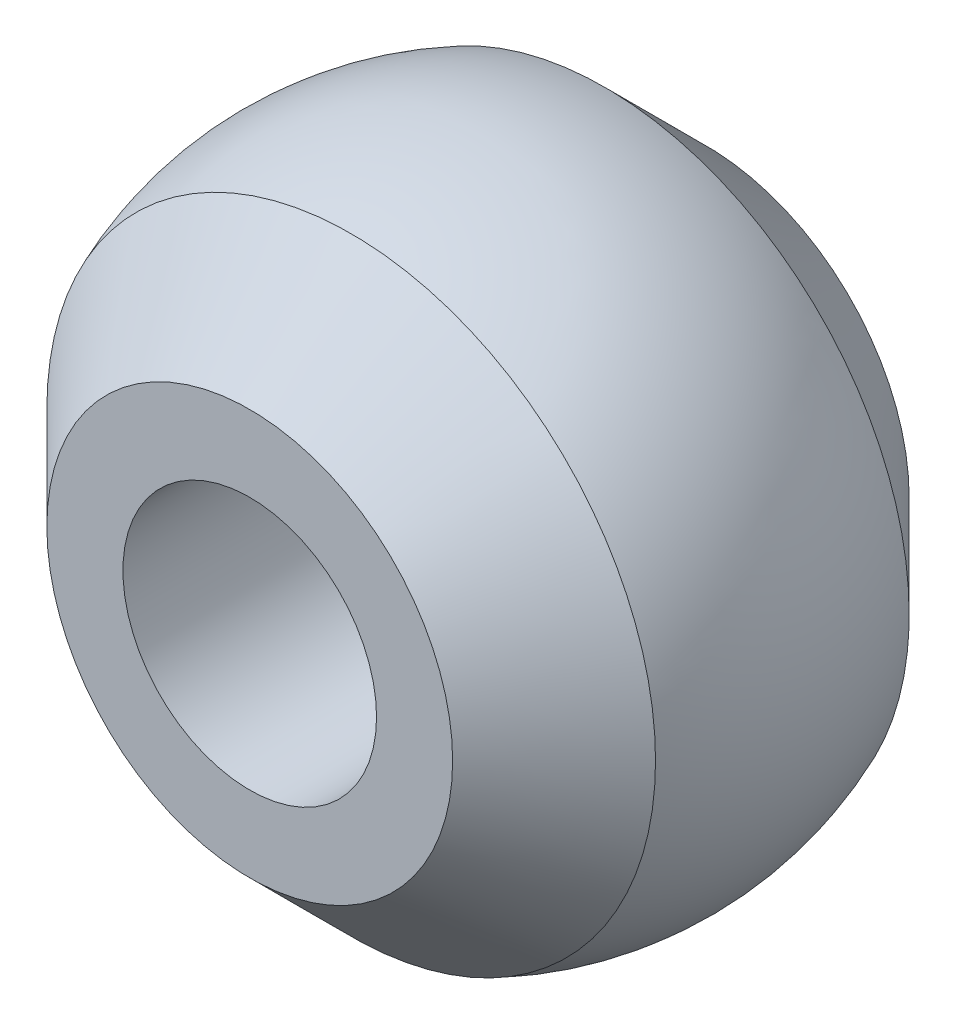
ISO-10303-21;
HEADER;
FILE_DESCRIPTION(('STEP AP214'),'2;1');
FILE_NAME('part.step','',(''),(''),'','','');
FILE_SCHEMA(('AUTOMOTIVE_DESIGN { 1 0 10303 214 1 1 1 1 }'));
ENDSEC;
DATA;
#1=APPLICATION_CONTEXT('core data for automotive mechanical design processes');
#2=APPLICATION_PROTOCOL_DEFINITION('international standard','automotive_design',2000,#1);
#3=PRODUCT_CONTEXT('',#1,'mechanical');
#4=PRODUCT('Part','Part','',(#3));
#5=PRODUCT_RELATED_PRODUCT_CATEGORY('part','',(#4));
#6=PRODUCT_DEFINITION_FORMATION('','',#4);
#7=PRODUCT_DEFINITION_CONTEXT('part definition',#1,'design');
#8=PRODUCT_DEFINITION('design','',#6,#7);
#9=PRODUCT_DEFINITION_SHAPE('','',#8);
#10=(LENGTH_UNIT() NAMED_UNIT(*) SI_UNIT(.MILLI.,.METRE.));
#11=(NAMED_UNIT(*) PLANE_ANGLE_UNIT() SI_UNIT($,.RADIAN.));
#12=(NAMED_UNIT(*) SI_UNIT($,.STERADIAN.) SOLID_ANGLE_UNIT());
#13=UNCERTAINTY_MEASURE_WITH_UNIT(LENGTH_MEASURE(1.E-05),#10,'distance_accuracy_value','');
#14=(GEOMETRIC_REPRESENTATION_CONTEXT(3) GLOBAL_UNCERTAINTY_ASSIGNED_CONTEXT((#13)) GLOBAL_UNIT_ASSIGNED_CONTEXT((#10,
#11,#12)) REPRESENTATION_CONTEXT('',''));
#15=CARTESIAN_POINT('',(0.,0.,0.));
#16=DIRECTION('',(0.,0.,1.));
#17=DIRECTION('',(1.,0.,0.));
#18=AXIS2_PLACEMENT_3D('',#15,#16,#17);
#19=CARTESIAN_POINT('',(0.,14.5,4.5));
#20=DIRECTION('',(0.,0.,1.));
#21=DIRECTION('',(1.,0.,0.));
#22=AXIS2_PLACEMENT_3D('',#19,#20,#21);
#23=PLANE('',#22);
#24=CARTESIAN_POINT('',(0.,14.5,4.5));
#25=DIRECTION('',(0.,0.,1.));
#26=DIRECTION('',(1.,0.,0.));
#27=AXIS2_PLACEMENT_3D('',#24,#25,#26);
#28=CIRCLE('',#27,2.5);
#29=CARTESIAN_POINT('',(2.5,14.5,4.5));
#30=VERTEX_POINT('',#29);
#31=EDGE_CURVE('E68',#30,#30,#28,.T.);
#32=ORIENTED_EDGE('',*,*,#31,.F.);
#33=EDGE_LOOP('',(#32));
#34=FACE_BOUND('',#33,.T.);
#35=CARTESIAN_POINT('',(0.,14.5,4.5));
#36=DIRECTION('',(0.,0.,1.));
#37=DIRECTION('',(1.,0.,0.));
#38=AXIS2_PLACEMENT_3D('',#35,#36,#37);
#39=CIRCLE('',#38,4.);
#40=CARTESIAN_POINT('',(4.,14.5,4.5));
#41=VERTEX_POINT('',#40);
#42=EDGE_CURVE('E11',#41,#41,#39,.T.);
#43=ORIENTED_EDGE('',*,*,#42,.T.);
#44=EDGE_LOOP('',(#43));
#45=FACE_BOUND('',#44,.T.);
#46=ADVANCED_FACE('F43',(#34,#45),#23,.T.);
#47=CARTESIAN_POINT('',(0.,14.5,4.5));
#48=DIRECTION('',(0.,0.,-1.));
#49=DIRECTION('',(-1.,0.,0.));
#50=AXIS2_PLACEMENT_3D('',#47,#48,#49);
#51=CONICAL_SURFACE('',#50,4.,0.785398163397448);
#52=ORIENTED_EDGE('',*,*,#42,.F.);
#53=EDGE_LOOP('',(#52));
#54=FACE_BOUND('',#53,.T.);
#55=CARTESIAN_POINT('',(0.,14.5,2.5));
#56=DIRECTION('',(0.,0.,1.));
#57=DIRECTION('',(1.,0.,0.));
#58=AXIS2_PLACEMENT_3D('',#55,#56,#57);
#59=CIRCLE('',#58,6.);
#60=CARTESIAN_POINT('',(6.,14.5,2.5));
#61=VERTEX_POINT('',#60);
#62=EDGE_CURVE('E76',#61,#61,#59,.T.);
#63=ORIENTED_EDGE('',*,*,#62,.T.);
#64=EDGE_LOOP('',(#63));
#65=FACE_BOUND('',#64,.T.);
#66=ADVANCED_FACE('F45',(#54,#65),#51,.T.);
#67=CARTESIAN_POINT('',(0.,14.5,-4.5));
#68=DIRECTION('',(0.,0.,-1.));
#69=DIRECTION('',(1.,0.,0.));
#70=AXIS2_PLACEMENT_3D('',#67,#68,#69);
#71=PLANE('',#70);
#72=CARTESIAN_POINT('',(0.,14.5,-4.5));
#73=DIRECTION('',(0.,0.,-1.));
#74=DIRECTION('',(-1.,0.,0.));
#75=AXIS2_PLACEMENT_3D('',#72,#73,#74);
#76=CIRCLE('',#75,2.5);
#77=CARTESIAN_POINT('',(-2.5,14.5,-4.5));
#78=VERTEX_POINT('',#77);
#79=EDGE_CURVE('E60',#78,#78,#76,.T.);
#80=ORIENTED_EDGE('',*,*,#79,.F.);
#81=EDGE_LOOP('',(#80));
#82=FACE_BOUND('',#81,.T.);
#83=CARTESIAN_POINT('',(0.,14.5,-4.5));
#84=DIRECTION('',(0.,0.,1.));
#85=DIRECTION('',(-1.,0.,0.));
#86=AXIS2_PLACEMENT_3D('',#83,#84,#85);
#87=CIRCLE('',#86,4.);
#88=CARTESIAN_POINT('',(-4.,14.5,-4.5));
#89=VERTEX_POINT('',#88);
#90=EDGE_CURVE('E54',#89,#89,#87,.T.);
#91=ORIENTED_EDGE('',*,*,#90,.F.);
#92=EDGE_LOOP('',(#91));
#93=FACE_BOUND('',#92,.T.);
#94=ADVANCED_FACE('F101',(#82,#93),#71,.T.);
#95=CARTESIAN_POINT('',(0.,14.5,-4.5));
#96=DIRECTION('',(0.,0.,1.));
#97=DIRECTION('',(-1.,0.,0.));
#98=AXIS2_PLACEMENT_3D('',#95,#96,#97);
#99=CONICAL_SURFACE('',#98,4.,0.785398163397448);
#100=ORIENTED_EDGE('',*,*,#90,.T.);
#101=EDGE_LOOP('',(#100));
#102=FACE_BOUND('',#101,.T.);
#103=CARTESIAN_POINT('',(6.,14.5,-2.5));
#104=CARTESIAN_POINT('',(6.00000208253265,14.5981748695653,-2.5));
#105=CARTESIAN_POINT('',(5.99759050275092,14.6963495619276,-2.5));
#106=CARTESIAN_POINT('',(5.98795497171115,14.8924625300015,-2.5));
#107=CARTESIAN_POINT('',(5.98073102045312,14.9904008057131,-2.5));
#108=CARTESIAN_POINT('',(5.96148569961324,15.1858048782416,-2.5));
#109=CARTESIAN_POINT('',(5.94946433003139,15.2832706750584,-2.5));
#110=CARTESIAN_POINT('',(5.92065378954598,15.4774950184059,-2.5));
#111=CARTESIAN_POINT('',(5.90386461864243,15.5742535649366,-2.5));
#112=CARTESIAN_POINT('',(5.86555874619633,15.7668302992569,-2.5));
#113=CARTESIAN_POINT('',(5.84404204465378,15.8626484870464,-2.5));
#114=CARTESIAN_POINT('',(5.79633299368075,16.0531136717927,-2.5));
#115=CARTESIAN_POINT('',(5.77014064425027,16.1477606687495,-2.5));
#116=CARTESIAN_POINT('',(5.71314338453624,16.3356554583041,-2.5));
#117=CARTESIAN_POINT('',(5.68233847425269,16.4289032509019,-2.5));
#118=CARTESIAN_POINT('',(5.61619030794355,16.6137749898048,-2.5));
#119=CARTESIAN_POINT('',(5.58084705191796,16.70539893611,-2.5));
#120=CARTESIAN_POINT('',(5.50570733821748,16.8868022522711,-2.5));
#121=CARTESIAN_POINT('',(5.46591088054258,16.9765816221271,-2.5));
#122=CARTESIAN_POINT('',(5.38196063693874,17.1540794990362,-2.5));
#123=CARTESIAN_POINT('',(5.33780685100979,17.2417980060893,-2.5));
#124=CARTESIAN_POINT('',(5.24524832117047,17.4149628358226,-2.5));
#125=CARTESIAN_POINT('',(5.19684357726009,17.5004091585029,-2.5));
#126=CARTESIAN_POINT('',(5.09589974274318,17.6688237718158,-2.5));
#127=CARTESIAN_POINT('',(5.04336065213664,17.7517920624485,-2.5));
#128=CARTESIAN_POINT('',(4.9342746954939,17.9150507337868,-2.5));
#129=CARTESIAN_POINT('',(4.87772782945769,17.9953411144924,-2.5));
#130=CARTESIAN_POINT('',(4.76076254831005,18.1530505394168,-2.5));
#131=CARTESIAN_POINT('',(4.70034413319862,18.2304695836357,-2.5));
#132=CARTESIAN_POINT('',(4.57578130715423,18.382249826328,-2.5));
#133=CARTESIAN_POINT('',(4.51163689622127,18.4566110248015,-2.5));
#134=CARTESIAN_POINT('',(4.37977660803824,18.6020964333627,-2.5));
#135=CARTESIAN_POINT('',(4.31206073078817,18.6732206434504,-2.5));
#136=CARTESIAN_POINT('',(4.1732206434504,18.8120607307882,-2.5));
#137=CARTESIAN_POINT('',(4.1020964333627,18.8797766080382,-2.5));
#138=CARTESIAN_POINT('',(3.95661102480152,19.0116368962213,-2.5));
#139=CARTESIAN_POINT('',(3.88224982632805,19.0757813071542,-2.5));
#140=CARTESIAN_POINT('',(3.7304695836357,19.2003441331986,-2.5));
#141=CARTESIAN_POINT('',(3.65305053941684,19.2607625483101,-2.5));
#142=CARTESIAN_POINT('',(3.49534111449236,19.3777278294576,-2.5));
#143=CARTESIAN_POINT('',(3.41505073378674,19.4342746954936,-2.5));
#144=CARTESIAN_POINT('',(3.25179206244848,19.5433606521369,-2.5));
#145=CARTESIAN_POINT('',(3.16882377181584,19.5958997427442,-2.5));
#146=CARTESIAN_POINT('',(3.00040915850282,19.696843577259,-2.5));
#147=CARTESIAN_POINT('',(2.91496283582245,19.7452483211665,-2.5));
#148=CARTESIAN_POINT('',(2.74179800608953,19.8378068510138,-2.5));
#149=CARTESIAN_POINT('',(2.65407949903697,19.8819606369536,-2.5));
#150=CARTESIAN_POINT('',(2.47658162212642,19.9659108805278,-2.5));
#151=CARTESIAN_POINT('',(2.38680225226841,20.0057073381621,-2.5));
#152=CARTESIAN_POINT('',(2.20539893611267,20.0808470519733,-2.5));
#153=CARTESIAN_POINT('',(2.11377498981494,20.1161903081501,-2.5));
#154=CARTESIAN_POINT('',(1.9289032508917,20.1823384740462,-2.5));
#155=CARTESIAN_POINT('',(1.83565545826619,20.2131433837655,-2.5));
#156=CARTESIAN_POINT('',(1.64776066878736,20.270140645021,-2.5));
#157=CARTESIAN_POINT('',(1.55311367193405,20.2963329965572,-2.5));
#158=CARTESIAN_POINT('',(1.36264848690513,20.3440420417773,-2.5));
#159=CARTESIAN_POINT('',(1.26683029872952,20.3655587354613,-2.5));
#160=CARTESIAN_POINT('',(1.07425356546402,20.4038646293774,-2.5));
#161=CARTESIAN_POINT('',(0.977495020374126,20.4206538296095,-2.5));
#162=CARTESIAN_POINT('',(0.783270673090214,20.4494642899679,-2.5));
#163=CARTESIAN_POINT('',(0.685804870896198,20.4614855500941,-2.5));
#164=CARTESIAN_POINT('',(0.490400813058528,20.4807311699722,-2.5));
#165=CARTESIAN_POINT('',(0.392462557414872,20.4879555297241,-2.5));
#166=CARTESIAN_POINT('',(0.196349534514145,20.497589944738,-2.5));
#167=CARTESIAN_POINT('',(0.0981747672570732,20.5,-2.5));
#168=CARTESIAN_POINT('',(-0.0981747672570702,20.5,-2.5));
#169=CARTESIAN_POINT('',(-0.196349534514142,20.497589944738,-2.5));
#170=CARTESIAN_POINT('',(-0.392462557414869,20.4879555297241,-2.5));
#171=CARTESIAN_POINT('',(-0.490400813058525,20.4807311699722,-2.5));
#172=CARTESIAN_POINT('',(-0.685804870896196,20.4614855500941,-2.5));
#173=CARTESIAN_POINT('',(-0.783270673090211,20.4494642899679,-2.5));
#174=CARTESIAN_POINT('',(-0.977495020374123,20.4206538296095,-2.5));
#175=CARTESIAN_POINT('',(-1.07425356546402,20.4038646293774,-2.5));
#176=CARTESIAN_POINT('',(-1.26683029872952,20.3655587354613,-2.5));
#177=CARTESIAN_POINT('',(-1.36264848690512,20.3440420417773,-2.5));
#178=CARTESIAN_POINT('',(-1.55311367193404,20.2963329965572,-2.5));
#179=CARTESIAN_POINT('',(-1.64776066878736,20.270140645021,-2.5));
#180=CARTESIAN_POINT('',(-1.83565545826619,20.2131433837655,-2.5));
#181=CARTESIAN_POINT('',(-1.9289032508917,20.1823384740462,-2.5));
#182=CARTESIAN_POINT('',(-2.11377498981494,20.1161903081501,-2.5));
#183=CARTESIAN_POINT('',(-2.20539893611267,20.0808470519733,-2.5));
#184=CARTESIAN_POINT('',(-2.38680225226841,20.0057073381621,-2.5));
#185=CARTESIAN_POINT('',(-2.47658162212641,19.9659108805278,-2.5));
#186=CARTESIAN_POINT('',(-2.65407949903697,19.8819606369536,-2.5));
#187=CARTESIAN_POINT('',(-2.74179800608952,19.8378068510138,-2.5));
#188=CARTESIAN_POINT('',(-2.91496283582245,19.7452483211665,-2.5));
#189=CARTESIAN_POINT('',(-3.00040915850282,19.696843577259,-2.5));
#190=CARTESIAN_POINT('',(-3.16882377181584,19.5958997427442,-2.5));
#191=CARTESIAN_POINT('',(-3.25179206244848,19.5433606521369,-2.5));
#192=CARTESIAN_POINT('',(-3.41505073378674,19.4342746954936,-2.5));
#193=CARTESIAN_POINT('',(-3.49534111449236,19.3777278294576,-2.5));
#194=CARTESIAN_POINT('',(-3.65305053941684,19.2607625483101,-2.5));
#195=CARTESIAN_POINT('',(-3.7304695836357,19.2003441331986,-2.5));
#196=CARTESIAN_POINT('',(-3.88224982632804,19.0757813071542,-2.5));
#197=CARTESIAN_POINT('',(-3.95661102480152,19.0116368962213,-2.5));
#198=CARTESIAN_POINT('',(-4.1020964333627,18.8797766080382,-2.5));
#199=CARTESIAN_POINT('',(-4.1732206434504,18.8120607307882,-2.5));
#200=CARTESIAN_POINT('',(-4.31206073078817,18.6732206434504,-2.5));
#201=CARTESIAN_POINT('',(-4.37977660803825,18.6020964333627,-2.5));
#202=CARTESIAN_POINT('',(-4.51163689622126,18.4566110248015,-2.5));
#203=CARTESIAN_POINT('',(-4.57578130715421,18.382249826328,-2.5));
#204=CARTESIAN_POINT('',(-4.70034413319864,18.2304695836357,-2.5));
#205=CARTESIAN_POINT('',(-4.76076254831013,18.1530505394168,-2.5));
#206=CARTESIAN_POINT('',(-4.87772782945761,17.9953411144924,-2.5));
#207=CARTESIAN_POINT('',(-4.93427469549361,17.9150507337867,-2.5));
#208=CARTESIAN_POINT('',(-5.04336065213693,17.7517920624485,-2.5));
#209=CARTESIAN_POINT('',(-5.09589974274424,17.6688237718158,-2.5));
#210=CARTESIAN_POINT('',(-5.19684357725902,17.5004091585028,-2.5));
#211=CARTESIAN_POINT('',(-5.24524832116649,17.4149628358225,-2.5));
#212=CARTESIAN_POINT('',(-5.33780685101377,17.2417980060895,-2.5));
#213=CARTESIAN_POINT('',(-5.38196063695357,17.154079499037,-2.5));
#214=CARTESIAN_POINT('',(-5.46591088052775,16.9765816221264,-2.5));
#215=CARTESIAN_POINT('',(-5.50570733816214,16.8868022522684,-2.5));
#216=CARTESIAN_POINT('',(-5.5808470519733,16.7053989361127,-2.5));
#217=CARTESIAN_POINT('',(-5.61619030815007,16.6137749898149,-2.5));
#218=CARTESIAN_POINT('',(-5.68233847404617,16.4289032508917,-2.5));
#219=CARTESIAN_POINT('',(-5.7131433837655,16.3356554582662,-2.5));
#220=CARTESIAN_POINT('',(-5.770140645021,16.1477606687874,-2.5));
#221=CARTESIAN_POINT('',(-5.79633299655718,16.053113671934,-2.5));
#222=CARTESIAN_POINT('',(-5.84404204177735,15.8626484869051,-2.5));
#223=CARTESIAN_POINT('',(-5.86555873546134,15.7668302987295,-2.5));
#224=CARTESIAN_POINT('',(-5.90386462937742,15.574253565464,-2.5));
#225=CARTESIAN_POINT('',(-5.92065382960951,15.4774950203741,-2.5));
#226=CARTESIAN_POINT('',(-5.94946428996786,15.2832706730902,-2.5));
#227=CARTESIAN_POINT('',(-5.96148555009412,15.1858048708962,-2.5));
#228=CARTESIAN_POINT('',(-5.98073116997224,14.9904008130585,-2.5));
#229=CARTESIAN_POINT('',(-5.98795552972409,14.8924625574149,-2.5));
#230=CARTESIAN_POINT('',(-5.99758994473797,14.6963495345141,-2.5));
#231=CARTESIAN_POINT('',(-6.,14.5981747672571,-2.5));
#232=CARTESIAN_POINT('',(-6.,14.4018252327429,-2.5));
#233=CARTESIAN_POINT('',(-5.99758994473797,14.3036504654859,-2.5));
#234=CARTESIAN_POINT('',(-5.98795552972409,14.1075374425851,-2.5));
#235=CARTESIAN_POINT('',(-5.98073116997224,14.0095991869415,-2.5));
#236=CARTESIAN_POINT('',(-5.96148555009412,13.8141951291038,-2.5));
#237=CARTESIAN_POINT('',(-5.94946428996786,13.7167293269098,-2.5));
#238=CARTESIAN_POINT('',(-5.92065382960951,13.5225049796259,-2.5));
#239=CARTESIAN_POINT('',(-5.90386462937742,13.425746434536,-2.5));
#240=CARTESIAN_POINT('',(-5.86555873546134,13.2331697012705,-2.5));
#241=CARTESIAN_POINT('',(-5.84404204177735,13.1373515130949,-2.5));
#242=CARTESIAN_POINT('',(-5.79633299655718,12.946886328066,-2.5));
#243=CARTESIAN_POINT('',(-5.770140645021,12.8522393312126,-2.5));
#244=CARTESIAN_POINT('',(-5.7131433837655,12.6643445417338,-2.5));
#245=CARTESIAN_POINT('',(-5.68233847404617,12.5710967491083,-2.5));
#246=CARTESIAN_POINT('',(-5.61619030815007,12.3862250101851,-2.5));
#247=CARTESIAN_POINT('',(-5.5808470519733,12.2946010638873,-2.5));
#248=CARTESIAN_POINT('',(-5.50570733816214,12.1131977477316,-2.5));
#249=CARTESIAN_POINT('',(-5.46591088052776,12.0234183778736,-2.5));
#250=CARTESIAN_POINT('',(-5.38196063695357,11.845920500963,-2.5));
#251=CARTESIAN_POINT('',(-5.33780685101377,11.7582019939105,-2.5));
#252=CARTESIAN_POINT('',(-5.2452483211665,11.5850371641776,-2.5));
#253=CARTESIAN_POINT('',(-5.19684357725902,11.4995908414972,-2.5));
#254=CARTESIAN_POINT('',(-5.09589974274424,11.3311762281842,-2.5));
#255=CARTESIAN_POINT('',(-5.04336065213693,11.2482079375515,-2.5));
#256=CARTESIAN_POINT('',(-4.93427469549362,11.0849492662133,-2.5));
#257=CARTESIAN_POINT('',(-4.87772782945762,11.0046588855076,-2.5));
#258=CARTESIAN_POINT('',(-4.76076254831013,10.8469494605832,-2.5));
#259=CARTESIAN_POINT('',(-4.70034413319864,10.7695304163643,-2.5));
#260=CARTESIAN_POINT('',(-4.57578130715421,10.617750173672,-2.5));
#261=CARTESIAN_POINT('',(-4.51163689622127,10.5433889751985,-2.5));
#262=CARTESIAN_POINT('',(-4.37977660803825,10.3979035666373,-2.5));
#263=CARTESIAN_POINT('',(-4.31206073078818,10.3267793565496,-2.5));
#264=CARTESIAN_POINT('',(-4.1732206434504,10.1879392692118,-2.5));
#265=CARTESIAN_POINT('',(-4.1020964333627,10.1202233919618,-2.5));
#266=CARTESIAN_POINT('',(-3.95661102480152,9.98836310377874,-2.5));
#267=CARTESIAN_POINT('',(-3.88224982632804,9.92421869284579,-2.5));
#268=CARTESIAN_POINT('',(-3.7304695836357,9.79965586680136,-2.5));
#269=CARTESIAN_POINT('',(-3.65305053941684,9.73923745168987,-2.5));
#270=CARTESIAN_POINT('',(-3.49534111449236,9.62227217054239,-2.5));
#271=CARTESIAN_POINT('',(-3.41505073378674,9.56572530450639,-2.5));
#272=CARTESIAN_POINT('',(-3.25179206244848,9.45663934786307,-2.5));
#273=CARTESIAN_POINT('',(-3.16882377181584,9.40410025725576,-2.5));
#274=CARTESIAN_POINT('',(-3.00040915850282,9.30315642274098,-2.5));
#275=CARTESIAN_POINT('',(-2.91496283582245,9.25475167883351,-2.5));
#276=CARTESIAN_POINT('',(-2.74179800608953,9.16219314898624,-2.5));
#277=CARTESIAN_POINT('',(-2.65407949903697,9.11803936304644,-2.5));
#278=CARTESIAN_POINT('',(-2.47658162212642,9.03408911947225,-2.5));
#279=CARTESIAN_POINT('',(-2.38680225226841,8.99429266183786,-2.5));
#280=CARTESIAN_POINT('',(-2.20539893611268,8.9191529480267,-2.5));
#281=CARTESIAN_POINT('',(-2.11377498981495,8.88380969184993,-2.5));
#282=CARTESIAN_POINT('',(-1.9289032508917,8.81766152595383,-2.5));
#283=CARTESIAN_POINT('',(-1.83565545826619,8.7868566162345,-2.5));
#284=CARTESIAN_POINT('',(-1.64776066878736,8.729859354979,-2.5));
#285=CARTESIAN_POINT('',(-1.55311367193405,8.70366700344282,-2.5));
#286=CARTESIAN_POINT('',(-1.36264848690513,8.65595795822265,-2.5));
#287=CARTESIAN_POINT('',(-1.26683029872952,8.63444126453866,-2.5));
#288=CARTESIAN_POINT('',(-1.07425356546402,8.59613537062257,-2.5));
#289=CARTESIAN_POINT('',(-0.977495020374125,8.57934617039049,-2.5));
#290=CARTESIAN_POINT('',(-0.783270673090215,8.55053571003214,-2.5));
#291=CARTESIAN_POINT('',(-0.685804870896199,8.53851444990588,-2.5));
#292=CARTESIAN_POINT('',(-0.490400813058528,8.51926883002776,-2.5));
#293=CARTESIAN_POINT('',(-0.392462557414873,8.5120444702759,-2.5));
#294=CARTESIAN_POINT('',(-0.196349534514146,8.50241005526203,-2.5));
#295=CARTESIAN_POINT('',(-0.098174767257074,8.5,-2.5));
#296=CARTESIAN_POINT('',(0.0981747672570696,8.5,-2.5));
#297=CARTESIAN_POINT('',(0.196349534514141,8.50241005526203,-2.5));
#298=CARTESIAN_POINT('',(0.392462557414872,8.5120444702759,-2.5));
#299=CARTESIAN_POINT('',(0.490400813058531,8.51926883002776,-2.5));
#300=CARTESIAN_POINT('',(0.685804870896202,8.53851444990588,-2.5));
#301=CARTESIAN_POINT('',(0.783270673090214,8.55053571003214,-2.5));
#302=CARTESIAN_POINT('',(0.97749502037412,8.57934617039049,-2.5));
#303=CARTESIAN_POINT('',(1.07425356546401,8.59613537062258,-2.5));
#304=CARTESIAN_POINT('',(1.26683029872951,8.63444126453866,-2.5));
#305=CARTESIAN_POINT('',(1.36264848690512,8.65595795822265,-2.5));
#306=CARTESIAN_POINT('',(1.55311367193404,8.70366700344282,-2.5));
#307=CARTESIAN_POINT('',(1.64776066878735,8.72985935497899,-2.5));
#308=CARTESIAN_POINT('',(1.83565545826618,8.7868566162345,-2.5));
#309=CARTESIAN_POINT('',(1.9289032508917,8.81766152595382,-2.5));
#310=CARTESIAN_POINT('',(2.11377498981494,8.88380969184993,-2.5));
#311=CARTESIAN_POINT('',(2.20539893611267,8.9191529480267,-2.5));
#312=CARTESIAN_POINT('',(2.38680225226841,8.99429266183786,-2.5));
#313=CARTESIAN_POINT('',(2.47658162212641,9.03408911947225,-2.5));
#314=CARTESIAN_POINT('',(2.65407949903697,9.11803936304644,-2.5));
#315=CARTESIAN_POINT('',(2.74179800608952,9.16219314898624,-2.5));
#316=CARTESIAN_POINT('',(2.91496283582245,9.25475167883351,-2.5));
#317=CARTESIAN_POINT('',(3.00040915850282,9.30315642274097,-2.5));
#318=CARTESIAN_POINT('',(3.16882377181584,9.40410025725576,-2.5));
#319=CARTESIAN_POINT('',(3.25179206244848,9.45663934786307,-2.5));
#320=CARTESIAN_POINT('',(3.41505073378674,9.56572530450639,-2.5));
#321=CARTESIAN_POINT('',(3.49534111449236,9.62227217054239,-2.5));
#322=CARTESIAN_POINT('',(3.65305053941684,9.73923745168988,-2.5));
#323=CARTESIAN_POINT('',(3.73046958363571,9.79965586680137,-2.5));
#324=CARTESIAN_POINT('',(3.88224982632804,9.92421869284579,-2.5));
#325=CARTESIAN_POINT('',(3.95661102480152,9.98836310377873,-2.5));
#326=CARTESIAN_POINT('',(4.1020964333627,10.1202233919617,-2.5));
#327=CARTESIAN_POINT('',(4.17322064345039,10.1879392692118,-2.5));
#328=CARTESIAN_POINT('',(4.31206073078816,10.3267793565496,-2.5));
#329=CARTESIAN_POINT('',(4.37977660803823,10.3979035666373,-2.5));
#330=CARTESIAN_POINT('',(4.51163689622127,10.5433889751985,-2.5));
#331=CARTESIAN_POINT('',(4.57578130715423,10.617750173672,-2.5));
#332=CARTESIAN_POINT('',(4.70034413319862,10.7695304163643,-2.5));
#333=CARTESIAN_POINT('',(4.76076254831005,10.8469494605832,-2.5));
#334=CARTESIAN_POINT('',(4.87772782945769,11.0046588855076,-2.5));
#335=CARTESIAN_POINT('',(4.9342746954939,11.0849492662132,-2.5));
#336=CARTESIAN_POINT('',(5.04336065213664,11.2482079375515,-2.5));
#337=CARTESIAN_POINT('',(5.09589974274318,11.3311762281842,-2.5));
#338=CARTESIAN_POINT('',(5.19684357726009,11.4995908414971,-2.5));
#339=CARTESIAN_POINT('',(5.24524832117047,11.5850371641774,-2.5));
#340=CARTESIAN_POINT('',(5.33780685100979,11.7582019939107,-2.5));
#341=CARTESIAN_POINT('',(5.38196063693874,11.8459205009638,-2.5));
#342=CARTESIAN_POINT('',(5.46591088054258,12.0234183778729,-2.5));
#343=CARTESIAN_POINT('',(5.50570733821748,12.1131977477289,-2.5));
#344=CARTESIAN_POINT('',(5.58084705191797,12.2946010638901,-2.5));
#345=CARTESIAN_POINT('',(5.61619030794356,12.3862250101952,-2.5));
#346=CARTESIAN_POINT('',(5.68233847425269,12.5710967490982,-2.5));
#347=CARTESIAN_POINT('',(5.71314338453624,12.664344541696,-2.5));
#348=CARTESIAN_POINT('',(5.77014064425027,12.8522393312505,-2.5));
#349=CARTESIAN_POINT('',(5.79633299368075,12.9468863282073,-2.5));
#350=CARTESIAN_POINT('',(5.84404204465378,13.1373515129536,-2.5));
#351=CARTESIAN_POINT('',(5.86555874619633,13.2331697007431,-2.5));
#352=CARTESIAN_POINT('',(5.90386461864243,13.4257464350633,-2.5));
#353=CARTESIAN_POINT('',(5.92065378954598,13.5225049815941,-2.5));
#354=CARTESIAN_POINT('',(5.94946433003139,13.7167293249416,-2.5));
#355=CARTESIAN_POINT('',(5.96148569961324,13.8141951217584,-2.5));
#356=CARTESIAN_POINT('',(5.98073102045312,14.0095991942869,-2.5));
#357=CARTESIAN_POINT('',(5.98795497171115,14.1075374699985,-2.5));
#358=CARTESIAN_POINT('',(5.99759050275092,14.3036504380724,-2.5));
#359=CARTESIAN_POINT('',(6.00000208253265,14.4018251304347,-2.5));
#360=CARTESIAN_POINT('',(6.,14.5,-2.5));
#361=B_SPLINE_CURVE_WITH_KNOTS('',3,(#103,#104,#105,#106,#107,#108,#109,#110,#111,#112,#113,
#114,#115,#116,#117,#118,#119,#120,#121,#122,#123,#124,#125,#126,#127,#128,#129,#130,#131,#132,
#133,#134,#135,#136,#137,#138,#139,#140,#141,#142,#143,#144,#145,#146,#147,#148,#149,#150,#151,
#152,#153,#154,#155,#156,#157,#158,#159,#160,#161,#162,#163,#164,#165,#166,#167,#168,#169,#170,
#171,#172,#173,#174,#175,#176,#177,#178,#179,#180,#181,#182,#183,#184,#185,#186,#187,#188,#189,
#190,#191,#192,#193,#194,#195,#196,#197,#198,#199,#200,#201,#202,#203,#204,#205,#206,#207,#208,
#209,#210,#211,#212,#213,#214,#215,#216,#217,#218,#219,#220,#221,#222,#223,#224,#225,#226,#227,
#228,#229,#230,#231,#232,#233,#234,#235,#236,#237,#238,#239,#240,#241,#242,#243,#244,#245,#246,
#247,#248,#249,#250,#251,#252,#253,#254,#255,#256,#257,#258,#259,#260,#261,#262,#263,#264,#265,
#266,#267,#268,#269,#270,#271,#272,#273,#274,#275,#276,#277,#278,#279,#280,#281,#282,#283,#284,
#285,#286,#287,#288,#289,#290,#291,#292,#293,#294,#295,#296,#297,#298,#299,#300,#301,#302,#303,
#304,#305,#306,#307,#308,#309,#310,#311,#312,#313,#314,#315,#316,#317,#318,#319,#320,#321,#322,
#323,#324,#325,#326,#327,#328,#329,#330,#331,#332,#333,#334,#335,#336,#337,#338,#339,#340,#341,
#342,#343,#344,#345,#346,#347,#348,#349,#350,#351,#352,#353,#354,#355,#356,#357,#358,#359,#360),
.UNSPECIFIED.,.F.,.F.,(4,2,2,2,2,2,2,2,2,2,2,2,2,2,2,2,2,2,2,2,2,2,2,2,2,2,2,2,2,2,2,2,2,2,2,2,
2,2,2,2,2,2,2,2,2,2,2,2,2,2,2,2,2,2,2,2,2,2,2,2,2,2,2,2,2,2,2,2,2,2,2,2,2,2,2,2,2,2,2,2,2,2,2,2,
2,2,2,2,2,2,2,2,2,2,2,2,2,2,2,2,2,2,2,2,2,2,2,2,2,2,2,2,2,2,2,2,2,2,2,2,2,2,2,2,2,2,2,2,4),(0.,
0.294494742274946,0.588989484549899,0.88348422682484,1.17797896909979,1.47247371137474,
1.76696845364969,2.06146319592464,2.35595793819958,2.65045268047453,2.94494742274948,
3.23944216502442,3.53393690729937,3.82843164957432,4.12292639184926,4.41742113412421,
4.71191587639916,5.00641061867411,5.30090536094905,5.595400103224,5.88989484549895,
6.1843895877739,6.47888433004884,6.77337907232379,7.06787381459874,7.36236855687368,
7.65686329914864,7.95135804142358,8.24585278369853,8.54034752597348,8.83484226824843,
9.12933701052337,9.42383175279832,9.71832649507327,10.0128212373482,10.3073159796232,
10.6018107218981,10.8963054641731,11.190800206448,11.485294948723,11.7797896909979,
12.0742844332728,12.3687791755478,12.6632739178227,12.9577686600977,13.2522634023726,
13.5467581446476,13.8412528869225,14.1357476291975,14.4302423714724,14.7247371137474,
15.0192318560223,15.3137265982973,15.6082213405722,15.9027160828472,16.1972108251221,
16.491705567397,16.786200309672,17.0806950519469,17.3751897942219,17.6696845364968,
17.9641792787718,18.2586740210467,18.5531687633217,18.8476635055966,19.1421582478716,
19.4366529901465,19.7311477324215,20.0256424746964,20.3201372169714,20.6146319592463,
20.9091267015213,21.2036214437962,21.4981161860711,21.7926109283461,22.087105670621,
22.381600412896,22.6760951551709,22.9705898974459,23.2650846397208,23.5595793819958,
23.8540741242707,24.1485688665457,24.4430636088206,24.7375583510956,25.0320530933705,
25.3265478356455,25.6210425779204,25.9155373201954,26.2100320624703,26.5045268047453,
26.7990215470202,27.0935162892951,27.3880110315701,27.682505773845,27.97700051612,
28.2714952583949,28.5659900006699,28.8604847429448,29.1549794852198,29.4494742274947,
29.7439689697697,30.0384637120446,30.3329584543196,30.6274531965945,30.9219479388695,
31.2164426811444,31.5109374234193,31.8054321656943,32.0999269079692,32.3944216502442,
32.6889163925191,32.9834111347941,33.277905877069,33.572400619344,33.8668953616189,
34.1613901038939,34.4558848461688,34.7503795884438,35.0448743307187,35.3393690729937,
35.6338638152686,35.9283585575436,36.2228532998185,36.5173480420935,36.8118427843684,
37.1063375266434,37.4008322689183,37.6953270111933),.UNSPECIFIED.);
#362=CARTESIAN_POINT('',(6.,14.5,-2.5));
#363=VERTEX_POINT('',#362);
#364=EDGE_CURVE('E72',#363,#363,#361,.T.);
#365=ORIENTED_EDGE('',*,*,#364,.F.);
#366=EDGE_LOOP('',(#365));
#367=FACE_BOUND('',#366,.T.);
#368=ADVANCED_FACE('F91',(#102,#367),#99,.T.);
#369=CARTESIAN_POINT('',(0.,14.5,-5.5));
#370=DIRECTION('',(0.,0.,1.));
#371=DIRECTION('',(1.,0.,0.));
#372=AXIS2_PLACEMENT_3D('',#369,#370,#371);
#373=CYLINDRICAL_SURFACE('',#372,2.5);
#374=ORIENTED_EDGE('',*,*,#79,.T.);
#375=EDGE_LOOP('',(#374));
#376=FACE_BOUND('',#375,.T.);
#377=ORIENTED_EDGE('',*,*,#31,.T.);
#378=EDGE_LOOP('',(#377));
#379=FACE_BOUND('',#378,.T.);
#380=ADVANCED_FACE('F100',(#376,#379),#373,.F.);
#381=CARTESIAN_POINT('',(0.,14.5,0.));
#382=DIRECTION('',(0.,0.,1.));
#383=DIRECTION('',(0.,1.,0.));
#384=AXIS2_PLACEMENT_3D('',#381,#382,#383);
#385=SPHERICAL_SURFACE('',#384,6.5);
#386=ORIENTED_EDGE('',*,*,#62,.F.);
#387=EDGE_LOOP('',(#386));
#388=FACE_BOUND('',#387,.T.);
#389=ORIENTED_EDGE('',*,*,#364,.T.);
#390=EDGE_LOOP('',(#389));
#391=FACE_BOUND('',#390,.T.);
#392=ADVANCED_FACE('F73',(#388,#391),#385,.T.);
#393=CLOSED_SHELL('',(#46,#66,#94,#368,#380,#392));
#394=MANIFOLD_SOLID_BREP('B2',#393);
#395=ADVANCED_BREP_SHAPE_REPRESENTATION('',(#18,#394),#14);
#396=SHAPE_DEFINITION_REPRESENTATION(#9,#395);
ENDSEC;
END-ISO-10303-21;
